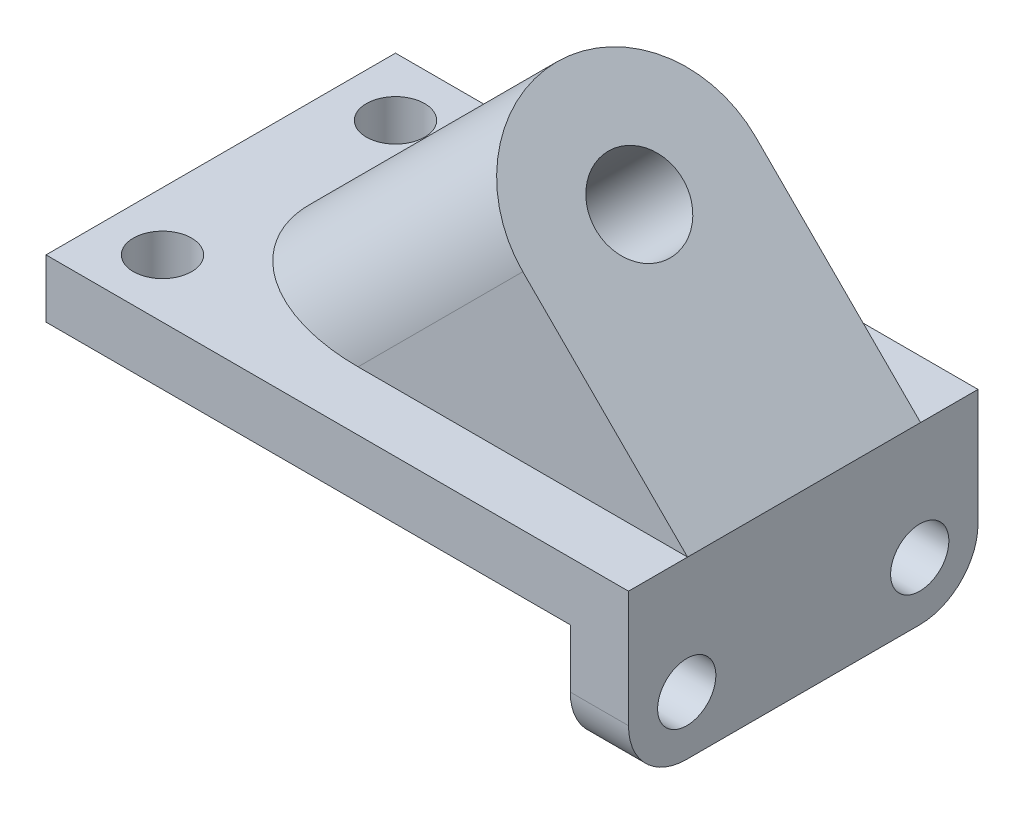
ISO-10303-21;
HEADER;
FILE_DESCRIPTION(('STEP AP214'),'2;1');
FILE_NAME('part.step','',(''),(''),'','','');
FILE_SCHEMA(('AUTOMOTIVE_DESIGN { 1 0 10303 214 1 1 1 1 }'));
ENDSEC;
DATA;
#1=APPLICATION_CONTEXT('core data for automotive mechanical design processes');
#2=APPLICATION_PROTOCOL_DEFINITION('international standard','automotive_design',2000,#1);
#3=PRODUCT_CONTEXT('',#1,'mechanical');
#4=PRODUCT('Part','Part','',(#3));
#5=PRODUCT_RELATED_PRODUCT_CATEGORY('part','',(#4));
#6=PRODUCT_DEFINITION_FORMATION('','',#4);
#7=PRODUCT_DEFINITION_CONTEXT('part definition',#1,'design');
#8=PRODUCT_DEFINITION('design','',#6,#7);
#9=PRODUCT_DEFINITION_SHAPE('','',#8);
#10=(LENGTH_UNIT() NAMED_UNIT(*) SI_UNIT(.MILLI.,.METRE.));
#11=(NAMED_UNIT(*) PLANE_ANGLE_UNIT() SI_UNIT($,.RADIAN.));
#12=(NAMED_UNIT(*) SI_UNIT($,.STERADIAN.) SOLID_ANGLE_UNIT());
#13=UNCERTAINTY_MEASURE_WITH_UNIT(LENGTH_MEASURE(1.E-05),#10,'distance_accuracy_value','');
#14=(GEOMETRIC_REPRESENTATION_CONTEXT(3) GLOBAL_UNCERTAINTY_ASSIGNED_CONTEXT((#13)) GLOBAL_UNIT_ASSIGNED_CONTEXT((#10,
#11,#12)) REPRESENTATION_CONTEXT('',''));
#15=CARTESIAN_POINT('',(0.,0.,0.));
#16=DIRECTION('',(0.,0.,1.));
#17=DIRECTION('',(1.,0.,0.));
#18=AXIS2_PLACEMENT_3D('',#15,#16,#17);
#19=CARTESIAN_POINT('',(0.,12.7,-76.2));
#20=DIRECTION('',(1.,0.,0.));
#21=DIRECTION('',(0.,0.,-1.));
#22=AXIS2_PLACEMENT_3D('',#19,#20,#21);
#23=PLANE('',#22);
#24=DIRECTION('',(0.,0.,1.));
#25=VECTOR('',#24,1.);
#26=CARTESIAN_POINT('',(0.,0.,-76.2));
#27=LINE('',#26,#25);
#28=CARTESIAN_POINT('',(0.,0.,-76.2));
#29=VERTEX_POINT('',#28);
#30=CARTESIAN_POINT('',(0.,0.,0.));
#31=VERTEX_POINT('',#30);
#32=EDGE_CURVE('E180',#29,#31,#27,.T.);
#33=ORIENTED_EDGE('',*,*,#32,.T.);
#34=DIRECTION('',(0.,-1.,0.));
#35=VECTOR('',#34,1.);
#36=CARTESIAN_POINT('',(0.,12.7,0.));
#37=LINE('',#36,#35);
#38=CARTESIAN_POINT('',(0.,12.7,0.));
#39=VERTEX_POINT('',#38);
#40=EDGE_CURVE('E220',#39,#31,#37,.T.);
#41=ORIENTED_EDGE('',*,*,#40,.F.);
#42=DIRECTION('',(0.,0.,1.));
#43=VECTOR('',#42,1.);
#44=CARTESIAN_POINT('',(0.,12.7,-76.2));
#45=LINE('',#44,#43);
#46=CARTESIAN_POINT('',(0.,12.7,-76.2));
#47=VERTEX_POINT('',#46);
#48=EDGE_CURVE('E183',#47,#39,#45,.T.);
#49=ORIENTED_EDGE('',*,*,#48,.F.);
#50=DIRECTION('',(0.,-1.,0.));
#51=VECTOR('',#50,1.);
#52=CARTESIAN_POINT('',(0.,12.7,-76.2));
#53=LINE('',#52,#51);
#54=EDGE_CURVE('E199',#47,#29,#53,.T.);
#55=ORIENTED_EDGE('',*,*,#54,.T.);
#56=EDGE_LOOP('',(#33,#41,#49,#55));
#57=FACE_BOUND('',#56,.T.);
#58=ADVANCED_FACE('F45',(#57),#23,.F.);
#59=CARTESIAN_POINT('',(0.,12.7,0.));
#60=DIRECTION('',(0.,0.,-1.));
#61=DIRECTION('',(-1.,0.,0.));
#62=AXIS2_PLACEMENT_3D('',#59,#60,#61);
#63=PLANE('',#62);
#64=DIRECTION('',(0.,1.,0.));
#65=VECTOR('',#64,1.);
#66=CARTESIAN_POINT('',(114.3,-25.4,0.));
#67=LINE('',#66,#65);
#68=CARTESIAN_POINT('',(114.3,-12.7,0.));
#69=VERTEX_POINT('',#68);
#70=CARTESIAN_POINT('',(114.3,0.,0.));
#71=VERTEX_POINT('',#70);
#72=EDGE_CURVE('E177',#69,#71,#67,.T.);
#73=ORIENTED_EDGE('',*,*,#72,.F.);
#74=DIRECTION('',(1.,0.,0.));
#75=VECTOR('',#74,1.);
#76=CARTESIAN_POINT('',(127.,-12.7,0.));
#77=LINE('',#76,#75);
#78=CARTESIAN_POINT('',(127.,-12.7,0.));
#79=VERTEX_POINT('',#78);
#80=EDGE_CURVE('E228',#69,#79,#77,.T.);
#81=ORIENTED_EDGE('',*,*,#80,.T.);
#82=DIRECTION('',(0.,-1.,0.));
#83=VECTOR('',#82,1.);
#84=CARTESIAN_POINT('',(127.,12.7,0.));
#85=LINE('',#84,#83);
#86=CARTESIAN_POINT('',(127.,12.7,0.));
#87=VERTEX_POINT('',#86);
#88=EDGE_CURVE('E216',#87,#79,#85,.T.);
#89=ORIENTED_EDGE('',*,*,#88,.F.);
#90=DIRECTION('',(1.,0.,0.));
#91=VECTOR('',#90,1.);
#92=CARTESIAN_POINT('',(0.,12.7,0.));
#93=LINE('',#92,#91);
#94=EDGE_CURVE('E187',#39,#87,#93,.T.);
#95=ORIENTED_EDGE('',*,*,#94,.F.);
#96=ORIENTED_EDGE('',*,*,#40,.T.);
#97=DIRECTION('',(1.,0.,0.));
#98=VECTOR('',#97,1.);
#99=CARTESIAN_POINT('',(0.,0.,0.));
#100=LINE('',#99,#98);
#101=EDGE_CURVE('E203',#31,#71,#100,.T.);
#102=ORIENTED_EDGE('',*,*,#101,.T.);
#103=EDGE_LOOP('',(#73,#81,#89,#95,#96,#102));
#104=FACE_BOUND('',#103,.T.);
#105=ADVANCED_FACE('F312',(#104),#63,.F.);
#106=CARTESIAN_POINT('',(127.,12.7,0.));
#107=DIRECTION('',(-1.,0.,0.));
#108=DIRECTION('',(0.,0.,1.));
#109=AXIS2_PLACEMENT_3D('',#106,#107,#108);
#110=PLANE('',#109);
#111=CARTESIAN_POINT('',(127.,-12.7,-12.7));
#112=DIRECTION('',(1.,0.,0.));
#113=DIRECTION('',(0.,0.,-1.));
#114=AXIS2_PLACEMENT_3D('',#111,#112,#113);
#115=CIRCLE('',#114,6.35);
#116=CARTESIAN_POINT('',(127.,-12.7,-19.05));
#117=VERTEX_POINT('',#116);
#118=EDGE_CURVE('E263',#117,#117,#115,.T.);
#119=ORIENTED_EDGE('',*,*,#118,.F.);
#120=EDGE_LOOP('',(#119));
#121=FACE_BOUND('',#120,.T.);
#122=CARTESIAN_POINT('',(127.,-12.7,-63.5));
#123=DIRECTION('',(1.,0.,0.));
#124=DIRECTION('',(0.,0.,-1.));
#125=AXIS2_PLACEMENT_3D('',#122,#123,#124);
#126=CIRCLE('',#125,6.35);
#127=CARTESIAN_POINT('',(127.,-12.7,-69.85));
#128=VERTEX_POINT('',#127);
#129=EDGE_CURVE('E271',#128,#128,#126,.T.);
#130=ORIENTED_EDGE('',*,*,#129,.F.);
#131=EDGE_LOOP('',(#130));
#132=FACE_BOUND('',#131,.T.);
#133=DIRECTION('',(0.,0.,-1.));
#134=VECTOR('',#133,1.);
#135=CARTESIAN_POINT('',(127.,-25.4,-76.2));
#136=LINE('',#135,#134);
#137=CARTESIAN_POINT('',(127.,-25.4,-12.7));
#138=VERTEX_POINT('',#137);
#139=CARTESIAN_POINT('',(127.,-25.4,-63.5));
#140=VERTEX_POINT('',#139);
#141=EDGE_CURVE('E169',#138,#140,#136,.T.);
#142=ORIENTED_EDGE('',*,*,#141,.T.);
#143=CARTESIAN_POINT('',(127.,-12.7,-63.5));
#144=DIRECTION('',(-1.,0.,0.));
#145=DIRECTION('',(0.,0.,1.));
#146=AXIS2_PLACEMENT_3D('',#143,#144,#145);
#147=CIRCLE('',#146,12.7);
#148=CARTESIAN_POINT('',(127.,-12.7,-76.2));
#149=VERTEX_POINT('',#148);
#150=EDGE_CURVE('E55',#140,#149,#147,.F.);
#151=ORIENTED_EDGE('',*,*,#150,.T.);
#152=DIRECTION('',(0.,-1.,0.));
#153=VECTOR('',#152,1.);
#154=CARTESIAN_POINT('',(127.,12.7,-76.2));
#155=LINE('',#154,#153);
#156=CARTESIAN_POINT('',(127.,12.7,-76.2));
#157=VERTEX_POINT('',#156);
#158=EDGE_CURVE('E212',#157,#149,#155,.T.);
#159=ORIENTED_EDGE('',*,*,#158,.F.);
#160=DIRECTION('',(0.,0.,-1.));
#161=VECTOR('',#160,1.);
#162=CARTESIAN_POINT('',(127.,12.7,0.));
#163=LINE('',#162,#161);
#164=CARTESIAN_POINT('',(127.,12.7,-63.678120433143));
#165=VERTEX_POINT('',#164);
#166=EDGE_CURVE('E191',#165,#157,#163,.T.);
#167=ORIENTED_EDGE('',*,*,#166,.F.);
#168=DIRECTION('',(0.,0.,-1.));
#169=VECTOR('',#168,1.);
#170=CARTESIAN_POINT('',(127.,12.7,-63.678120433143));
#171=LINE('',#170,#169);
#172=CARTESIAN_POINT('',(127.,12.7,-12.878120433143));
#173=VERTEX_POINT('',#172);
#174=EDGE_CURVE('E141',#173,#165,#171,.T.);
#175=ORIENTED_EDGE('',*,*,#174,.F.);
#176=EDGE_CURVE('E192',#87,#173,#163,.T.);
#177=ORIENTED_EDGE('',*,*,#176,.F.);
#178=ORIENTED_EDGE('',*,*,#88,.T.);
#179=CARTESIAN_POINT('',(127.,-12.7,-12.7));
#180=DIRECTION('',(-1.,0.,0.));
#181=DIRECTION('',(0.,0.,1.));
#182=AXIS2_PLACEMENT_3D('',#179,#180,#181);
#183=CIRCLE('',#182,12.7);
#184=EDGE_CURVE('E232',#79,#138,#183,.F.);
#185=ORIENTED_EDGE('',*,*,#184,.T.);
#186=EDGE_LOOP('',(#142,#151,#159,#167,#175,#177,#178,#185));
#187=FACE_BOUND('',#186,.T.);
#188=ADVANCED_FACE('F296',(#121,#132,#187),#110,.F.);
#189=CARTESIAN_POINT('',(127.,12.7,-76.2));
#190=DIRECTION('',(0.,0.,1.));
#191=DIRECTION('',(1.,0.,0.));
#192=AXIS2_PLACEMENT_3D('',#189,#190,#191);
#193=PLANE('',#192);
#194=ORIENTED_EDGE('',*,*,#158,.T.);
#195=DIRECTION('',(-1.,0.,0.));
#196=VECTOR('',#195,1.);
#197=CARTESIAN_POINT('',(114.3,-12.7,-76.2));
#198=LINE('',#197,#196);
#199=CARTESIAN_POINT('',(114.3,-12.7,-76.2));
#200=VERTEX_POINT('',#199);
#201=EDGE_CURVE('E242',#149,#200,#198,.T.);
#202=ORIENTED_EDGE('',*,*,#201,.T.);
#203=DIRECTION('',(0.,1.,0.));
#204=VECTOR('',#203,1.);
#205=CARTESIAN_POINT('',(114.3,-25.4,-76.2));
#206=LINE('',#205,#204);
#207=CARTESIAN_POINT('',(114.3,0.,-76.2));
#208=VERTEX_POINT('',#207);
#209=EDGE_CURVE('E176',#200,#208,#206,.T.);
#210=ORIENTED_EDGE('',*,*,#209,.T.);
#211=DIRECTION('',(-1.,0.,0.));
#212=VECTOR('',#211,1.);
#213=CARTESIAN_POINT('',(127.,0.,-76.2));
#214=LINE('',#213,#212);
#215=EDGE_CURVE('E188',#208,#29,#214,.T.);
#216=ORIENTED_EDGE('',*,*,#215,.T.);
#217=ORIENTED_EDGE('',*,*,#54,.F.);
#218=DIRECTION('',(-1.,0.,0.));
#219=VECTOR('',#218,1.);
#220=CARTESIAN_POINT('',(127.,12.7,-76.2));
#221=LINE('',#220,#219);
#222=EDGE_CURVE('E196',#157,#47,#221,.T.);
#223=ORIENTED_EDGE('',*,*,#222,.F.);
#224=EDGE_LOOP('',(#194,#202,#210,#216,#217,#223));
#225=FACE_BOUND('',#224,.T.);
#226=ADVANCED_FACE('F304',(#225),#193,.F.);
#227=CARTESIAN_POINT('',(0.,12.7,0.));
#228=DIRECTION('',(0.,1.,0.));
#229=DIRECTION('',(0.,0.,1.));
#230=AXIS2_PLACEMENT_3D('',#227,#228,#229);
#231=PLANE('',#230);
#232=CARTESIAN_POINT('',(12.7,12.7,-63.5));
#233=DIRECTION('',(0.,1.,0.));
#234=DIRECTION('',(0.,0.,1.));
#235=AXIS2_PLACEMENT_3D('',#232,#233,#234);
#236=CIRCLE('',#235,6.35);
#237=CARTESIAN_POINT('',(12.7,12.7,-57.15));
#238=VERTEX_POINT('',#237);
#239=EDGE_CURVE('E257',#238,#238,#236,.T.);
#240=ORIENTED_EDGE('',*,*,#239,.F.);
#241=EDGE_LOOP('',(#240));
#242=FACE_BOUND('',#241,.T.);
#243=CARTESIAN_POINT('',(12.7,12.7,-12.7));
#244=DIRECTION('',(0.,1.,0.));
#245=DIRECTION('',(0.,0.,1.));
#246=AXIS2_PLACEMENT_3D('',#243,#244,#245);
#247=CIRCLE('',#246,6.35);
#248=CARTESIAN_POINT('',(12.7,12.7,-6.35));
#249=VERTEX_POINT('',#248);
#250=EDGE_CURVE('E269',#249,#249,#247,.T.);
#251=ORIENTED_EDGE('',*,*,#250,.F.);
#252=EDGE_LOOP('',(#251));
#253=FACE_BOUND('',#252,.T.);
#254=CARTESIAN_POINT('',(55.1579510314467,12.7,-38.278120433143));
#255=DIRECTION('',(0.,1.,0.));
#256=DIRECTION('',(1.,0.,0.));
#257=AXIS2_PLACEMENT_3D('',#254,#255,#256);
#258=ELLIPSE('',#257,35.9210244842767,25.4);
#259=CARTESIAN_POINT('',(55.1579510314467,12.7,-12.878120433143));
#260=VERTEX_POINT('',#259);
#261=CARTESIAN_POINT('',(55.1579510314467,12.7,-63.678120433143));
#262=VERTEX_POINT('',#261);
#263=EDGE_CURVE('E288',#260,#262,#258,.F.);
#264=ORIENTED_EDGE('',*,*,#263,.T.);
#265=DIRECTION('',(1.,0.,0.));
#266=VECTOR('',#265,1.);
#267=CARTESIAN_POINT('',(21.8899565270854,12.7,-63.678120433143));
#268=LINE('',#267,#266);
#269=EDGE_CURVE('E63',#262,#165,#268,.T.);
#270=ORIENTED_EDGE('',*,*,#269,.T.);
#271=ORIENTED_EDGE('',*,*,#166,.T.);
#272=ORIENTED_EDGE('',*,*,#222,.T.);
#273=ORIENTED_EDGE('',*,*,#48,.T.);
#274=ORIENTED_EDGE('',*,*,#94,.T.);
#275=ORIENTED_EDGE('',*,*,#176,.T.);
#276=DIRECTION('',(-1.,0.,0.));
#277=VECTOR('',#276,1.);
#278=CARTESIAN_POINT('',(21.8899565270854,12.7,-12.878120433143));
#279=LINE('',#278,#277);
#280=EDGE_CURVE('E173',#173,#260,#279,.T.);
#281=ORIENTED_EDGE('',*,*,#280,.T.);
#282=EDGE_LOOP('',(#264,#270,#271,#272,#273,#274,#275,#281));
#283=FACE_BOUND('',#282,.T.);
#284=ADVANCED_FACE('F293',(#242,#253,#283),#231,.T.);
#285=CARTESIAN_POINT('',(0.,0.,0.));
#286=DIRECTION('',(0.,1.,0.));
#287=DIRECTION('',(0.,0.,1.));
#288=AXIS2_PLACEMENT_3D('',#285,#286,#287);
#289=PLANE('',#288);
#290=CARTESIAN_POINT('',(12.7,0.,-63.5));
#291=DIRECTION('',(0.,1.,0.));
#292=DIRECTION('',(0.,0.,1.));
#293=AXIS2_PLACEMENT_3D('',#290,#291,#292);
#294=CIRCLE('',#293,6.35);
#295=CARTESIAN_POINT('',(12.7,0.,-57.15));
#296=VERTEX_POINT('',#295);
#297=EDGE_CURVE('E159',#296,#296,#294,.T.);
#298=ORIENTED_EDGE('',*,*,#297,.T.);
#299=EDGE_LOOP('',(#298));
#300=FACE_BOUND('',#299,.T.);
#301=CARTESIAN_POINT('',(12.7,0.,-12.7));
#302=DIRECTION('',(0.,1.,0.));
#303=DIRECTION('',(0.,0.,1.));
#304=AXIS2_PLACEMENT_3D('',#301,#302,#303);
#305=CIRCLE('',#304,6.35);
#306=CARTESIAN_POINT('',(12.7,0.,-6.35));
#307=VERTEX_POINT('',#306);
#308=EDGE_CURVE('E253',#307,#307,#305,.T.);
#309=ORIENTED_EDGE('',*,*,#308,.T.);
#310=EDGE_LOOP('',(#309));
#311=FACE_BOUND('',#310,.T.);
#312=ORIENTED_EDGE('',*,*,#215,.F.);
#313=DIRECTION('',(0.,0.,1.));
#314=VECTOR('',#313,1.);
#315=CARTESIAN_POINT('',(114.3,0.,0.));
#316=LINE('',#315,#314);
#317=EDGE_CURVE('E224',#208,#71,#316,.T.);
#318=ORIENTED_EDGE('',*,*,#317,.T.);
#319=ORIENTED_EDGE('',*,*,#101,.F.);
#320=ORIENTED_EDGE('',*,*,#32,.F.);
#321=EDGE_LOOP('',(#312,#318,#319,#320));
#322=FACE_BOUND('',#321,.T.);
#323=ADVANCED_FACE('F353',(#300,#311,#322),#289,.F.);
#324=CARTESIAN_POINT('',(114.3,-25.4,-76.2));
#325=DIRECTION('',(-1.,0.,0.));
#326=DIRECTION('',(0.,0.,1.));
#327=AXIS2_PLACEMENT_3D('',#324,#325,#326);
#328=PLANE('',#327);
#329=CARTESIAN_POINT('',(114.3,-12.7,-12.7));
#330=DIRECTION('',(-1.,0.,0.));
#331=DIRECTION('',(0.,0.,1.));
#332=AXIS2_PLACEMENT_3D('',#329,#330,#331);
#333=CIRCLE('',#332,6.35);
#334=CARTESIAN_POINT('',(114.3,-12.7,-19.05));
#335=VERTEX_POINT('',#334);
#336=EDGE_CURVE('E49',#335,#335,#333,.T.);
#337=ORIENTED_EDGE('',*,*,#336,.F.);
#338=EDGE_LOOP('',(#337));
#339=FACE_BOUND('',#338,.T.);
#340=CARTESIAN_POINT('',(114.3,-12.7,-63.5));
#341=DIRECTION('',(-1.,0.,0.));
#342=DIRECTION('',(0.,0.,1.));
#343=AXIS2_PLACEMENT_3D('',#340,#341,#342);
#344=CIRCLE('',#343,6.35);
#345=CARTESIAN_POINT('',(114.3,-12.7,-69.85));
#346=VERTEX_POINT('',#345);
#347=EDGE_CURVE('E260',#346,#346,#344,.T.);
#348=ORIENTED_EDGE('',*,*,#347,.F.);
#349=EDGE_LOOP('',(#348));
#350=FACE_BOUND('',#349,.T.);
#351=ORIENTED_EDGE('',*,*,#209,.F.);
#352=CARTESIAN_POINT('',(114.3,-12.7,-63.5));
#353=DIRECTION('',(-1.,0.,0.));
#354=DIRECTION('',(0.,0.,1.));
#355=AXIS2_PLACEMENT_3D('',#352,#353,#354);
#356=CIRCLE('',#355,12.7);
#357=CARTESIAN_POINT('',(114.3,-25.4,-63.5));
#358=VERTEX_POINT('',#357);
#359=EDGE_CURVE('E246',#200,#358,#356,.T.);
#360=ORIENTED_EDGE('',*,*,#359,.T.);
#361=DIRECTION('',(0.,0.,1.));
#362=VECTOR('',#361,1.);
#363=CARTESIAN_POINT('',(114.3,-25.4,-76.2));
#364=LINE('',#363,#362);
#365=CARTESIAN_POINT('',(114.3,-25.4,-12.7));
#366=VERTEX_POINT('',#365);
#367=EDGE_CURVE('E172',#358,#366,#364,.T.);
#368=ORIENTED_EDGE('',*,*,#367,.T.);
#369=CARTESIAN_POINT('',(114.3,-12.7,-12.7));
#370=DIRECTION('',(-1.,0.,0.));
#371=DIRECTION('',(0.,0.,1.));
#372=AXIS2_PLACEMENT_3D('',#369,#370,#371);
#373=CIRCLE('',#372,12.7);
#374=EDGE_CURVE('E239',#366,#69,#373,.T.);
#375=ORIENTED_EDGE('',*,*,#374,.T.);
#376=ORIENTED_EDGE('',*,*,#72,.T.);
#377=ORIENTED_EDGE('',*,*,#317,.F.);
#378=EDGE_LOOP('',(#351,#360,#368,#375,#376,#377));
#379=FACE_BOUND('',#378,.T.);
#380=ADVANCED_FACE('F344',(#339,#350,#379),#328,.T.);
#381=CARTESIAN_POINT('',(0.,-25.4,0.));
#382=DIRECTION('',(0.,-1.,0.));
#383=DIRECTION('',(0.,0.,-1.));
#384=AXIS2_PLACEMENT_3D('',#381,#382,#383);
#385=PLANE('',#384);
#386=ORIENTED_EDGE('',*,*,#367,.F.);
#387=DIRECTION('',(-1.,0.,0.));
#388=VECTOR('',#387,1.);
#389=CARTESIAN_POINT('',(127.,-25.4,-63.5));
#390=LINE('',#389,#388);
#391=EDGE_CURVE('E71',#358,#140,#390,.F.);
#392=ORIENTED_EDGE('',*,*,#391,.T.);
#393=ORIENTED_EDGE('',*,*,#141,.F.);
#394=DIRECTION('',(1.,0.,0.));
#395=VECTOR('',#394,1.);
#396=CARTESIAN_POINT('',(114.3,-25.4,-12.7));
#397=LINE('',#396,#395);
#398=EDGE_CURVE('E235',#138,#366,#397,.F.);
#399=ORIENTED_EDGE('',*,*,#398,.T.);
#400=EDGE_LOOP('',(#386,#392,#393,#399));
#401=FACE_BOUND('',#400,.T.);
#402=ADVANCED_FACE('F335',(#401),#385,.T.);
#403=CARTESIAN_POINT('',(0.,-12.7,-12.7));
#404=DIRECTION('',(-1.,0.,0.));
#405=DIRECTION('',(0.,0.,1.));
#406=AXIS2_PLACEMENT_3D('',#403,#404,#405);
#407=CYLINDRICAL_SURFACE('',#406,12.7);
#408=ORIENTED_EDGE('',*,*,#374,.F.);
#409=ORIENTED_EDGE('',*,*,#398,.F.);
#410=ORIENTED_EDGE('',*,*,#184,.F.);
#411=ORIENTED_EDGE('',*,*,#80,.F.);
#412=EDGE_LOOP('',(#408,#409,#410,#411));
#413=FACE_BOUND('',#412,.T.);
#414=ADVANCED_FACE('F333',(#413),#407,.T.);
#415=CARTESIAN_POINT('',(127.,-12.7,-63.5));
#416=DIRECTION('',(1.,0.,0.));
#417=DIRECTION('',(0.,0.,-1.));
#418=AXIS2_PLACEMENT_3D('',#415,#416,#417);
#419=CYLINDRICAL_SURFACE('',#418,12.7);
#420=ORIENTED_EDGE('',*,*,#150,.F.);
#421=ORIENTED_EDGE('',*,*,#391,.F.);
#422=ORIENTED_EDGE('',*,*,#359,.F.);
#423=ORIENTED_EDGE('',*,*,#201,.F.);
#424=EDGE_LOOP('',(#420,#421,#422,#423));
#425=FACE_BOUND('',#424,.T.);
#426=ADVANCED_FACE('F47',(#425),#419,.T.);
#427=CARTESIAN_POINT('',(-14.0310679571912,-56.4890189886376,-38.278120433143));
#428=DIRECTION('',(0.707106781186549,0.707106781186546,0.));
#429=DIRECTION('',(-0.707106781186546,0.707106781186549,0.));
#430=AXIS2_PLACEMENT_3D('',#427,#428,#429);
#431=CYLINDRICAL_SURFACE('',#430,9.525);
#432=CARTESIAN_POINT('',(55.1579510314467,12.7,-38.278120433143));
#433=DIRECTION('',(0.,1.,0.));
#434=DIRECTION('',(1.,0.,0.));
#435=AXIS2_PLACEMENT_3D('',#432,#433,#434);
#436=ELLIPSE('',#435,13.4703841816038,9.525);
#437=CARTESIAN_POINT('',(68.6283352130504,12.7,-38.278120433143));
#438=VERTEX_POINT('',#437);
#439=EDGE_CURVE('E11',#438,#438,#436,.F.);
#440=ORIENTED_EDGE('',*,*,#439,.T.);
#441=EDGE_LOOP('',(#440));
#442=FACE_BOUND('',#441,.T.);
#443=CARTESIAN_POINT('',(91.0789755157235,48.6210244842767,-38.278120433143));
#444=DIRECTION('',(0.707106781186549,0.707106781186546,0.));
#445=DIRECTION('',(-0.707106781186546,0.707106781186549,0.));
#446=AXIS2_PLACEMENT_3D('',#443,#444,#445);
#447=CIRCLE('',#446,9.525);
#448=CARTESIAN_POINT('',(84.3437834249216,55.3562165750786,-38.278120433143));
#449=VERTEX_POINT('',#448);
#450=EDGE_CURVE('E155',#449,#449,#447,.T.);
#451=ORIENTED_EDGE('',*,*,#450,.T.);
#452=EDGE_LOOP('',(#451));
#453=FACE_BOUND('',#452,.T.);
#454=ADVANCED_FACE('F341',(#442,#453),#431,.F.);
#455=CARTESIAN_POINT('',(91.0789755157235,48.6210244842767,-38.278120433143));
#456=DIRECTION('',(-0.707106781186549,-0.707106781186546,0.));
#457=DIRECTION('',(0.707106781186546,-0.707106781186549,0.));
#458=AXIS2_PLACEMENT_3D('',#455,#456,#457);
#459=PLANE('',#458);
#460=ORIENTED_EDGE('',*,*,#450,.F.);
#461=EDGE_LOOP('',(#460));
#462=FACE_BOUND('',#461,.T.);
#463=DIRECTION('',(-0.707106781186546,0.707106781186549,0.));
#464=VECTOR('',#463,1.);
#465=CARTESIAN_POINT('',(127.,12.7,-63.678120433143));
#466=LINE('',#465,#464);
#467=CARTESIAN_POINT('',(91.0789755157235,48.6210244842767,-63.678120433143));
#468=VERTEX_POINT('',#467);
#469=EDGE_CURVE('E134',#165,#468,#466,.T.);
#470=ORIENTED_EDGE('',*,*,#469,.T.);
#471=CARTESIAN_POINT('',(91.0789755157235,48.6210244842767,-38.278120433143));
#472=DIRECTION('',(0.707106781186549,0.707106781186546,0.));
#473=DIRECTION('',(0.707106781186546,-0.707106781186549,0.));
#474=AXIS2_PLACEMENT_3D('',#471,#472,#473);
#475=CIRCLE('',#474,25.4);
#476=CARTESIAN_POINT('',(91.0789755157235,48.6210244842767,-12.878120433143));
#477=VERTEX_POINT('',#476);
#478=EDGE_CURVE('E144',#468,#477,#475,.T.);
#479=ORIENTED_EDGE('',*,*,#478,.T.);
#480=DIRECTION('',(0.707106781186546,-0.707106781186549,0.));
#481=VECTOR('',#480,1.);
#482=CARTESIAN_POINT('',(127.,12.7,-12.878120433143));
#483=LINE('',#482,#481);
#484=EDGE_CURVE('E150',#477,#173,#483,.T.);
#485=ORIENTED_EDGE('',*,*,#484,.T.);
#486=ORIENTED_EDGE('',*,*,#174,.T.);
#487=EDGE_LOOP('',(#470,#479,#485,#486));
#488=FACE_BOUND('',#487,.T.);
#489=ADVANCED_FACE('F152',(#462,#488),#459,.F.);
#490=CARTESIAN_POINT('',(-14.0310679571912,-56.4890189886376,-38.278120433143));
#491=DIRECTION('',(0.707106781186549,0.707106781186546,0.));
#492=DIRECTION('',(-0.707106781186546,0.707106781186549,0.));
#493=AXIS2_PLACEMENT_3D('',#490,#491,#492);
#494=CYLINDRICAL_SURFACE('',#493,25.4);
#495=ORIENTED_EDGE('',*,*,#263,.F.);
#496=DIRECTION('',(0.707106781186549,0.707106781186546,0.));
#497=VECTOR('',#496,1.);
#498=CARTESIAN_POINT('',(-14.0310679571912,-56.4890189886376,-12.878120433143));
#499=LINE('',#498,#497);
#500=EDGE_CURVE('E140',#260,#477,#499,.T.);
#501=ORIENTED_EDGE('',*,*,#500,.T.);
#502=ORIENTED_EDGE('',*,*,#478,.F.);
#503=DIRECTION('',(0.707106781186549,0.707106781186546,0.));
#504=VECTOR('',#503,1.);
#505=CARTESIAN_POINT('',(-14.0310679571912,-56.4890189886376,-63.678120433143));
#506=LINE('',#505,#504);
#507=EDGE_CURVE('E130',#262,#468,#506,.T.);
#508=ORIENTED_EDGE('',*,*,#507,.F.);
#509=EDGE_LOOP('',(#495,#501,#502,#508));
#510=FACE_BOUND('',#509,.T.);
#511=ADVANCED_FACE('F145',(#510),#494,.T.);
#512=CARTESIAN_POINT('',(21.8899565270854,-92.4100434729143,-12.878120433143));
#513=DIRECTION('',(0.,0.,1.));
#514=DIRECTION('',(1.,0.,0.));
#515=AXIS2_PLACEMENT_3D('',#512,#513,#514);
#516=PLANE('',#515);
#517=ORIENTED_EDGE('',*,*,#280,.F.);
#518=ORIENTED_EDGE('',*,*,#484,.F.);
#519=ORIENTED_EDGE('',*,*,#500,.F.);
#520=EDGE_LOOP('',(#517,#518,#519));
#521=FACE_BOUND('',#520,.T.);
#522=ADVANCED_FACE('F315',(#521),#516,.T.);
#523=CARTESIAN_POINT('',(21.8899565270854,-92.4100434729143,-63.678120433143));
#524=DIRECTION('',(0.,0.,-1.));
#525=DIRECTION('',(-1.,0.,0.));
#526=AXIS2_PLACEMENT_3D('',#523,#524,#525);
#527=PLANE('',#526);
#528=ORIENTED_EDGE('',*,*,#269,.F.);
#529=ORIENTED_EDGE('',*,*,#507,.T.);
#530=ORIENTED_EDGE('',*,*,#469,.F.);
#531=EDGE_LOOP('',(#528,#529,#530));
#532=FACE_BOUND('',#531,.T.);
#533=ADVANCED_FACE('F132',(#532),#527,.T.);
#534=ORIENTED_EDGE('',*,*,#439,.F.);
#535=EDGE_LOOP('',(#534));
#536=FACE_BOUND('',#535,.T.);
#537=ADVANCED_FACE('F322',(#536),#231,.T.);
#538=CARTESIAN_POINT('',(12.7,-25.4,-12.7));
#539=DIRECTION('',(0.,1.,0.));
#540=DIRECTION('',(0.,0.,1.));
#541=AXIS2_PLACEMENT_3D('',#538,#539,#540);
#542=CYLINDRICAL_SURFACE('',#541,6.35);
#543=CARTESIAN_POINT('',(12.7,12.7,-6.35));
#544=CARTESIAN_POINT('',(12.7,12.5677083333333,-6.35));
#545=CARTESIAN_POINT('',(12.7,12.4354166666667,-6.35));
#546=CARTESIAN_POINT('',(12.7,12.1708333333333,-6.35));
#547=CARTESIAN_POINT('',(12.7,12.0385416666667,-6.35));
#548=CARTESIAN_POINT('',(12.7,11.7739583333333,-6.35));
#549=CARTESIAN_POINT('',(12.7,11.6416666666667,-6.35));
#550=CARTESIAN_POINT('',(12.7,11.3770833333333,-6.35));
#551=CARTESIAN_POINT('',(12.7,11.2447916666667,-6.35));
#552=CARTESIAN_POINT('',(12.7,10.9802083333333,-6.35));
#553=CARTESIAN_POINT('',(12.7,10.8479166666667,-6.35));
#554=CARTESIAN_POINT('',(12.7,10.5833333333333,-6.35));
#555=CARTESIAN_POINT('',(12.7,10.4510416666667,-6.35));
#556=CARTESIAN_POINT('',(12.7,10.1864583333333,-6.35));
#557=CARTESIAN_POINT('',(12.7,10.0541666666667,-6.35));
#558=CARTESIAN_POINT('',(12.7,9.78958333333333,-6.35));
#559=CARTESIAN_POINT('',(12.7,9.65729166666667,-6.35));
#560=CARTESIAN_POINT('',(12.7,9.39270833333333,-6.35));
#561=CARTESIAN_POINT('',(12.7,9.26041666666666,-6.35));
#562=CARTESIAN_POINT('',(12.7,8.99583333333333,-6.35));
#563=CARTESIAN_POINT('',(12.7,8.86354166666666,-6.35));
#564=CARTESIAN_POINT('',(12.7,8.59895833333333,-6.35));
#565=CARTESIAN_POINT('',(12.7,8.46666666666667,-6.35));
#566=CARTESIAN_POINT('',(12.7,8.20208333333333,-6.35));
#567=CARTESIAN_POINT('',(12.7,8.06979166666666,-6.35));
#568=CARTESIAN_POINT('',(12.7,7.80520833333333,-6.35));
#569=CARTESIAN_POINT('',(12.7,7.67291666666666,-6.35));
#570=CARTESIAN_POINT('',(12.7,7.40833333333333,-6.35));
#571=CARTESIAN_POINT('',(12.7,7.27604166666667,-6.35));
#572=CARTESIAN_POINT('',(12.7,7.01145833333333,-6.35));
#573=CARTESIAN_POINT('',(12.7,6.87916666666666,-6.35));
#574=CARTESIAN_POINT('',(12.7,6.61458333333333,-6.35));
#575=CARTESIAN_POINT('',(12.7,6.48229166666666,-6.35));
#576=CARTESIAN_POINT('',(12.7,6.21770833333333,-6.35));
#577=CARTESIAN_POINT('',(12.7,6.08541666666667,-6.35));
#578=CARTESIAN_POINT('',(12.7,5.82083333333333,-6.35));
#579=CARTESIAN_POINT('',(12.7,5.68854166666667,-6.35));
#580=CARTESIAN_POINT('',(12.7,5.42395833333333,-6.35));
#581=CARTESIAN_POINT('',(12.7,5.29166666666667,-6.35));
#582=CARTESIAN_POINT('',(12.7,5.02708333333333,-6.35));
#583=CARTESIAN_POINT('',(12.7,4.89479166666667,-6.35));
#584=CARTESIAN_POINT('',(12.7,4.63020833333334,-6.35));
#585=CARTESIAN_POINT('',(12.7,4.49791666666667,-6.35));
#586=CARTESIAN_POINT('',(12.7,4.23333333333333,-6.35));
#587=CARTESIAN_POINT('',(12.7,4.10104166666667,-6.35));
#588=CARTESIAN_POINT('',(12.7,3.83645833333333,-6.35));
#589=CARTESIAN_POINT('',(12.7,3.70416666666667,-6.35));
#590=CARTESIAN_POINT('',(12.7,3.43958333333333,-6.35));
#591=CARTESIAN_POINT('',(12.7,3.30729166666667,-6.35));
#592=CARTESIAN_POINT('',(12.7,3.04270833333333,-6.35));
#593=CARTESIAN_POINT('',(12.7,2.91041666666667,-6.35));
#594=CARTESIAN_POINT('',(12.7,2.64583333333333,-6.35));
#595=CARTESIAN_POINT('',(12.7,2.51354166666667,-6.35));
#596=CARTESIAN_POINT('',(12.7,2.24895833333333,-6.35));
#597=CARTESIAN_POINT('',(12.7,2.11666666666667,-6.35));
#598=CARTESIAN_POINT('',(12.7,1.85208333333333,-6.35));
#599=CARTESIAN_POINT('',(12.7,1.71979166666667,-6.35));
#600=CARTESIAN_POINT('',(12.7,1.45520833333333,-6.35));
#601=CARTESIAN_POINT('',(12.7,1.32291666666667,-6.35));
#602=CARTESIAN_POINT('',(12.7,1.05833333333333,-6.35));
#603=CARTESIAN_POINT('',(12.7,0.926041666666666,-6.35));
#604=CARTESIAN_POINT('',(12.7,0.661458333333332,-6.35));
#605=CARTESIAN_POINT('',(12.7,0.529166666666665,-6.35));
#606=CARTESIAN_POINT('',(12.7,0.264583333333332,-6.35));
#607=CARTESIAN_POINT('',(12.7,0.132291666666666,-6.35));
#608=CARTESIAN_POINT('',(12.7,0.,-6.35));
#609=B_SPLINE_CURVE_WITH_KNOTS('',3,(#543,#544,#545,#546,#547,#548,#549,#550,#551,#552,#553,
#554,#555,#556,#557,#558,#559,#560,#561,#562,#563,#564,#565,#566,#567,#568,#569,#570,#571,#572,
#573,#574,#575,#576,#577,#578,#579,#580,#581,#582,#583,#584,#585,#586,#587,#588,#589,#590,#591,
#592,#593,#594,#595,#596,#597,#598,#599,#600,#601,#602,#603,#604,#605,#606,#607,#608),
.UNSPECIFIED.,.F.,.F.,(4,2,2,2,2,2,2,2,2,2,2,2,2,2,2,2,2,2,2,2,2,2,2,2,2,2,2,2,2,2,2,2,4),(0.,
0.396874999999998,0.793750000000003,1.190625,1.5875,1.984375,2.38125,2.778125,3.175,3.571875,
3.96875,4.365625,4.7625,5.159375,5.55625,5.953125,6.35,6.746875,7.14375,7.540625,7.9375,
8.334375,8.73125,9.128125,9.525,9.921875,10.31875,10.715625,11.1125,11.509375,11.90625,
12.303125,12.7),.UNSPECIFIED.);
#610=EDGE_CURVE('BSEAM386',#249,#307,#609,.T.);
#611=ORIENTED_EDGE('',*,*,#250,.T.);
#612=ORIENTED_EDGE('',*,*,#308,.F.);
#613=ORIENTED_EDGE('',*,*,#610,.T.);
#614=ORIENTED_EDGE('',*,*,#610,.F.);
#615=EDGE_LOOP('',(#611,#613,#612,#614));
#616=FACE_BOUND('',#615,.T.);
#617=ADVANCED_FACE('F386',(#616),#542,.F.);
#618=CARTESIAN_POINT('',(12.7,-25.4,-63.5));
#619=DIRECTION('',(0.,1.,0.));
#620=DIRECTION('',(0.,0.,1.));
#621=AXIS2_PLACEMENT_3D('',#618,#619,#620);
#622=CYLINDRICAL_SURFACE('',#621,6.35);
#623=CARTESIAN_POINT('',(12.7,12.7,-57.15));
#624=CARTESIAN_POINT('',(12.7,12.5677083333333,-57.15));
#625=CARTESIAN_POINT('',(12.7,12.4354166666667,-57.15));
#626=CARTESIAN_POINT('',(12.7,12.1708333333333,-57.15));
#627=CARTESIAN_POINT('',(12.7,12.0385416666667,-57.15));
#628=CARTESIAN_POINT('',(12.7,11.7739583333333,-57.15));
#629=CARTESIAN_POINT('',(12.7,11.6416666666667,-57.15));
#630=CARTESIAN_POINT('',(12.7,11.3770833333333,-57.15));
#631=CARTESIAN_POINT('',(12.7,11.2447916666667,-57.15));
#632=CARTESIAN_POINT('',(12.7,10.9802083333333,-57.15));
#633=CARTESIAN_POINT('',(12.7,10.8479166666667,-57.15));
#634=CARTESIAN_POINT('',(12.7,10.5833333333333,-57.15));
#635=CARTESIAN_POINT('',(12.7,10.4510416666667,-57.15));
#636=CARTESIAN_POINT('',(12.7,10.1864583333333,-57.15));
#637=CARTESIAN_POINT('',(12.7,10.0541666666667,-57.15));
#638=CARTESIAN_POINT('',(12.7,9.78958333333333,-57.15));
#639=CARTESIAN_POINT('',(12.7,9.65729166666667,-57.15));
#640=CARTESIAN_POINT('',(12.7,9.39270833333333,-57.15));
#641=CARTESIAN_POINT('',(12.7,9.26041666666666,-57.15));
#642=CARTESIAN_POINT('',(12.7,8.99583333333333,-57.15));
#643=CARTESIAN_POINT('',(12.7,8.86354166666666,-57.15));
#644=CARTESIAN_POINT('',(12.7,8.59895833333333,-57.15));
#645=CARTESIAN_POINT('',(12.7,8.46666666666667,-57.15));
#646=CARTESIAN_POINT('',(12.7,8.20208333333333,-57.15));
#647=CARTESIAN_POINT('',(12.7,8.06979166666666,-57.15));
#648=CARTESIAN_POINT('',(12.7,7.80520833333333,-57.15));
#649=CARTESIAN_POINT('',(12.7,7.67291666666666,-57.15));
#650=CARTESIAN_POINT('',(12.7,7.40833333333333,-57.15));
#651=CARTESIAN_POINT('',(12.7,7.27604166666667,-57.15));
#652=CARTESIAN_POINT('',(12.7,7.01145833333333,-57.15));
#653=CARTESIAN_POINT('',(12.7,6.87916666666666,-57.15));
#654=CARTESIAN_POINT('',(12.7,6.61458333333333,-57.15));
#655=CARTESIAN_POINT('',(12.7,6.48229166666666,-57.15));
#656=CARTESIAN_POINT('',(12.7,6.21770833333333,-57.15));
#657=CARTESIAN_POINT('',(12.7,6.08541666666667,-57.15));
#658=CARTESIAN_POINT('',(12.7,5.82083333333333,-57.15));
#659=CARTESIAN_POINT('',(12.7,5.68854166666667,-57.15));
#660=CARTESIAN_POINT('',(12.7,5.42395833333333,-57.15));
#661=CARTESIAN_POINT('',(12.7,5.29166666666667,-57.15));
#662=CARTESIAN_POINT('',(12.7,5.02708333333333,-57.15));
#663=CARTESIAN_POINT('',(12.7,4.89479166666667,-57.15));
#664=CARTESIAN_POINT('',(12.7,4.63020833333334,-57.15));
#665=CARTESIAN_POINT('',(12.7,4.49791666666667,-57.15));
#666=CARTESIAN_POINT('',(12.7,4.23333333333333,-57.15));
#667=CARTESIAN_POINT('',(12.7,4.10104166666667,-57.15));
#668=CARTESIAN_POINT('',(12.7,3.83645833333333,-57.15));
#669=CARTESIAN_POINT('',(12.7,3.70416666666667,-57.15));
#670=CARTESIAN_POINT('',(12.7,3.43958333333333,-57.15));
#671=CARTESIAN_POINT('',(12.7,3.30729166666667,-57.15));
#672=CARTESIAN_POINT('',(12.7,3.04270833333333,-57.15));
#673=CARTESIAN_POINT('',(12.7,2.91041666666667,-57.15));
#674=CARTESIAN_POINT('',(12.7,2.64583333333333,-57.15));
#675=CARTESIAN_POINT('',(12.7,2.51354166666667,-57.15));
#676=CARTESIAN_POINT('',(12.7,2.24895833333333,-57.15));
#677=CARTESIAN_POINT('',(12.7,2.11666666666667,-57.15));
#678=CARTESIAN_POINT('',(12.7,1.85208333333333,-57.15));
#679=CARTESIAN_POINT('',(12.7,1.71979166666667,-57.15));
#680=CARTESIAN_POINT('',(12.7,1.45520833333333,-57.15));
#681=CARTESIAN_POINT('',(12.7,1.32291666666667,-57.15));
#682=CARTESIAN_POINT('',(12.7,1.05833333333333,-57.15));
#683=CARTESIAN_POINT('',(12.7,0.926041666666666,-57.15));
#684=CARTESIAN_POINT('',(12.7,0.661458333333332,-57.15));
#685=CARTESIAN_POINT('',(12.7,0.529166666666665,-57.15));
#686=CARTESIAN_POINT('',(12.7,0.264583333333332,-57.15));
#687=CARTESIAN_POINT('',(12.7,0.132291666666666,-57.15));
#688=CARTESIAN_POINT('',(12.7,0.,-57.15));
#689=B_SPLINE_CURVE_WITH_KNOTS('',3,(#623,#624,#625,#626,#627,#628,#629,#630,#631,#632,#633,
#634,#635,#636,#637,#638,#639,#640,#641,#642,#643,#644,#645,#646,#647,#648,#649,#650,#651,#652,
#653,#654,#655,#656,#657,#658,#659,#660,#661,#662,#663,#664,#665,#666,#667,#668,#669,#670,#671,
#672,#673,#674,#675,#676,#677,#678,#679,#680,#681,#682,#683,#684,#685,#686,#687,#688),
.UNSPECIFIED.,.F.,.F.,(4,2,2,2,2,2,2,2,2,2,2,2,2,2,2,2,2,2,2,2,2,2,2,2,2,2,2,2,2,2,2,2,4),(0.,
0.396874999999998,0.793750000000003,1.190625,1.5875,1.984375,2.38125,2.778125,3.175,3.571875,
3.96875,4.365625,4.7625,5.159375,5.55625,5.953125,6.35,6.746875,7.14375,7.540625,7.9375,
8.334375,8.73125,9.128125,9.525,9.921875,10.31875,10.715625,11.1125,11.509375,11.90625,
12.303125,12.7),.UNSPECIFIED.);
#690=EDGE_CURVE('BSEAM379',#238,#296,#689,.T.);
#691=ORIENTED_EDGE('',*,*,#239,.T.);
#692=ORIENTED_EDGE('',*,*,#297,.F.);
#693=ORIENTED_EDGE('',*,*,#690,.T.);
#694=ORIENTED_EDGE('',*,*,#690,.F.);
#695=EDGE_LOOP('',(#691,#693,#692,#694));
#696=FACE_BOUND('',#695,.T.);
#697=ADVANCED_FACE('F379',(#696),#622,.F.);
#698=CARTESIAN_POINT('',(88.9,-12.7,-63.5));
#699=DIRECTION('',(1.,0.,0.));
#700=DIRECTION('',(0.,0.,-1.));
#701=AXIS2_PLACEMENT_3D('',#698,#699,#700);
#702=CYLINDRICAL_SURFACE('',#701,6.35);
#703=CARTESIAN_POINT('',(114.3,-12.7,-69.85));
#704=CARTESIAN_POINT('',(114.432291666667,-12.7,-69.85));
#705=CARTESIAN_POINT('',(114.564583333333,-12.7,-69.85));
#706=CARTESIAN_POINT('',(114.829166666667,-12.7,-69.85));
#707=CARTESIAN_POINT('',(114.961458333333,-12.7,-69.85));
#708=CARTESIAN_POINT('',(115.226041666667,-12.7,-69.85));
#709=CARTESIAN_POINT('',(115.358333333333,-12.7,-69.85));
#710=CARTESIAN_POINT('',(115.622916666667,-12.7,-69.85));
#711=CARTESIAN_POINT('',(115.755208333333,-12.7,-69.85));
#712=CARTESIAN_POINT('',(116.019791666667,-12.7,-69.85));
#713=CARTESIAN_POINT('',(116.152083333333,-12.7,-69.85));
#714=CARTESIAN_POINT('',(116.416666666667,-12.7,-69.85));
#715=CARTESIAN_POINT('',(116.548958333333,-12.7,-69.85));
#716=CARTESIAN_POINT('',(116.813541666667,-12.7,-69.85));
#717=CARTESIAN_POINT('',(116.945833333333,-12.7,-69.85));
#718=CARTESIAN_POINT('',(117.210416666667,-12.7,-69.85));
#719=CARTESIAN_POINT('',(117.342708333333,-12.7,-69.85));
#720=CARTESIAN_POINT('',(117.607291666667,-12.7,-69.85));
#721=CARTESIAN_POINT('',(117.739583333333,-12.7,-69.85));
#722=CARTESIAN_POINT('',(118.004166666667,-12.7,-69.85));
#723=CARTESIAN_POINT('',(118.136458333333,-12.7,-69.85));
#724=CARTESIAN_POINT('',(118.401041666667,-12.7,-69.85));
#725=CARTESIAN_POINT('',(118.533333333333,-12.7,-69.85));
#726=CARTESIAN_POINT('',(118.797916666667,-12.7,-69.85));
#727=CARTESIAN_POINT('',(118.930208333333,-12.7,-69.85));
#728=CARTESIAN_POINT('',(119.194791666667,-12.7,-69.85));
#729=CARTESIAN_POINT('',(119.327083333333,-12.7,-69.85));
#730=CARTESIAN_POINT('',(119.591666666667,-12.7,-69.85));
#731=CARTESIAN_POINT('',(119.723958333333,-12.7,-69.85));
#732=CARTESIAN_POINT('',(119.988541666667,-12.7,-69.85));
#733=CARTESIAN_POINT('',(120.120833333333,-12.7,-69.85));
#734=CARTESIAN_POINT('',(120.385416666667,-12.7,-69.85));
#735=CARTESIAN_POINT('',(120.517708333333,-12.7,-69.85));
#736=CARTESIAN_POINT('',(120.782291666667,-12.7,-69.85));
#737=CARTESIAN_POINT('',(120.914583333333,-12.7,-69.85));
#738=CARTESIAN_POINT('',(121.179166666667,-12.7,-69.85));
#739=CARTESIAN_POINT('',(121.311458333333,-12.7,-69.85));
#740=CARTESIAN_POINT('',(121.576041666667,-12.7,-69.85));
#741=CARTESIAN_POINT('',(121.708333333333,-12.7,-69.85));
#742=CARTESIAN_POINT('',(121.972916666667,-12.7,-69.85));
#743=CARTESIAN_POINT('',(122.105208333333,-12.7,-69.85));
#744=CARTESIAN_POINT('',(122.369791666667,-12.7,-69.85));
#745=CARTESIAN_POINT('',(122.502083333333,-12.7,-69.85));
#746=CARTESIAN_POINT('',(122.766666666667,-12.7,-69.85));
#747=CARTESIAN_POINT('',(122.898958333333,-12.7,-69.85));
#748=CARTESIAN_POINT('',(123.163541666667,-12.7,-69.85));
#749=CARTESIAN_POINT('',(123.295833333333,-12.7,-69.85));
#750=CARTESIAN_POINT('',(123.560416666667,-12.7,-69.85));
#751=CARTESIAN_POINT('',(123.692708333333,-12.7,-69.85));
#752=CARTESIAN_POINT('',(123.957291666667,-12.7,-69.85));
#753=CARTESIAN_POINT('',(124.089583333333,-12.7,-69.85));
#754=CARTESIAN_POINT('',(124.354166666667,-12.7,-69.85));
#755=CARTESIAN_POINT('',(124.486458333333,-12.7,-69.85));
#756=CARTESIAN_POINT('',(124.751041666667,-12.7,-69.85));
#757=CARTESIAN_POINT('',(124.883333333333,-12.7,-69.85));
#758=CARTESIAN_POINT('',(125.147916666667,-12.7,-69.85));
#759=CARTESIAN_POINT('',(125.280208333333,-12.7,-69.85));
#760=CARTESIAN_POINT('',(125.544791666667,-12.7,-69.85));
#761=CARTESIAN_POINT('',(125.677083333333,-12.7,-69.85));
#762=CARTESIAN_POINT('',(125.941666666667,-12.7,-69.85));
#763=CARTESIAN_POINT('',(126.073958333333,-12.7,-69.85));
#764=CARTESIAN_POINT('',(126.338541666667,-12.7,-69.85));
#765=CARTESIAN_POINT('',(126.470833333333,-12.7,-69.85));
#766=CARTESIAN_POINT('',(126.735416666667,-12.7,-69.85));
#767=CARTESIAN_POINT('',(126.867708333333,-12.7,-69.85));
#768=CARTESIAN_POINT('',(127.,-12.7,-69.85));
#769=B_SPLINE_CURVE_WITH_KNOTS('',3,(#703,#704,#705,#706,#707,#708,#709,#710,#711,#712,#713,
#714,#715,#716,#717,#718,#719,#720,#721,#722,#723,#724,#725,#726,#727,#728,#729,#730,#731,#732,
#733,#734,#735,#736,#737,#738,#739,#740,#741,#742,#743,#744,#745,#746,#747,#748,#749,#750,#751,
#752,#753,#754,#755,#756,#757,#758,#759,#760,#761,#762,#763,#764,#765,#766,#767,#768),
.UNSPECIFIED.,.F.,.F.,(4,2,2,2,2,2,2,2,2,2,2,2,2,2,2,2,2,2,2,2,2,2,2,2,2,2,2,2,2,2,2,2,4),(0.,
0.396875000000005,0.793749999999996,1.190625,1.58750000000001,1.98437500000001,2.38125,
2.77812500000001,3.17500000000001,3.571875,3.96875000000001,4.36562500000001,4.7625,
5.15937500000001,5.55625000000001,5.953125,6.35000000000001,6.746875,7.14375,7.54062500000001,
7.9375,8.334375,8.73125000000001,9.128125,9.52500000000001,9.92187500000001,10.31875,10.715625,
11.1125,11.509375,11.90625,12.303125,12.7),.UNSPECIFIED.);
#770=EDGE_CURVE('BSEAM376',#346,#128,#769,.T.);
#771=ORIENTED_EDGE('',*,*,#347,.T.);
#772=ORIENTED_EDGE('',*,*,#129,.T.);
#773=ORIENTED_EDGE('',*,*,#770,.T.);
#774=ORIENTED_EDGE('',*,*,#770,.F.);
#775=EDGE_LOOP('',(#771,#773,#772,#774));
#776=FACE_BOUND('',#775,.T.);
#777=ADVANCED_FACE('F376',(#776),#702,.F.);
#778=CARTESIAN_POINT('',(88.9,-12.7,-12.7));
#779=DIRECTION('',(1.,0.,0.));
#780=DIRECTION('',(0.,0.,-1.));
#781=AXIS2_PLACEMENT_3D('',#778,#779,#780);
#782=CYLINDRICAL_SURFACE('',#781,6.35);
#783=CARTESIAN_POINT('',(114.3,-12.7,-19.05));
#784=CARTESIAN_POINT('',(114.432291666667,-12.7,-19.05));
#785=CARTESIAN_POINT('',(114.564583333333,-12.7,-19.05));
#786=CARTESIAN_POINT('',(114.829166666667,-12.7,-19.05));
#787=CARTESIAN_POINT('',(114.961458333333,-12.7,-19.05));
#788=CARTESIAN_POINT('',(115.226041666667,-12.7,-19.05));
#789=CARTESIAN_POINT('',(115.358333333333,-12.7,-19.05));
#790=CARTESIAN_POINT('',(115.622916666667,-12.7,-19.05));
#791=CARTESIAN_POINT('',(115.755208333333,-12.7,-19.05));
#792=CARTESIAN_POINT('',(116.019791666667,-12.7,-19.05));
#793=CARTESIAN_POINT('',(116.152083333333,-12.7,-19.05));
#794=CARTESIAN_POINT('',(116.416666666667,-12.7,-19.05));
#795=CARTESIAN_POINT('',(116.548958333333,-12.7,-19.05));
#796=CARTESIAN_POINT('',(116.813541666667,-12.7,-19.05));
#797=CARTESIAN_POINT('',(116.945833333333,-12.7,-19.05));
#798=CARTESIAN_POINT('',(117.210416666667,-12.7,-19.05));
#799=CARTESIAN_POINT('',(117.342708333333,-12.7,-19.05));
#800=CARTESIAN_POINT('',(117.607291666667,-12.7,-19.05));
#801=CARTESIAN_POINT('',(117.739583333333,-12.7,-19.05));
#802=CARTESIAN_POINT('',(118.004166666667,-12.7,-19.05));
#803=CARTESIAN_POINT('',(118.136458333333,-12.7,-19.05));
#804=CARTESIAN_POINT('',(118.401041666667,-12.7,-19.05));
#805=CARTESIAN_POINT('',(118.533333333333,-12.7,-19.05));
#806=CARTESIAN_POINT('',(118.797916666667,-12.7,-19.05));
#807=CARTESIAN_POINT('',(118.930208333333,-12.7,-19.05));
#808=CARTESIAN_POINT('',(119.194791666667,-12.7,-19.05));
#809=CARTESIAN_POINT('',(119.327083333333,-12.7,-19.05));
#810=CARTESIAN_POINT('',(119.591666666667,-12.7,-19.05));
#811=CARTESIAN_POINT('',(119.723958333333,-12.7,-19.05));
#812=CARTESIAN_POINT('',(119.988541666667,-12.7,-19.05));
#813=CARTESIAN_POINT('',(120.120833333333,-12.7,-19.05));
#814=CARTESIAN_POINT('',(120.385416666667,-12.7,-19.05));
#815=CARTESIAN_POINT('',(120.517708333333,-12.7,-19.05));
#816=CARTESIAN_POINT('',(120.782291666667,-12.7,-19.05));
#817=CARTESIAN_POINT('',(120.914583333333,-12.7,-19.05));
#818=CARTESIAN_POINT('',(121.179166666667,-12.7,-19.05));
#819=CARTESIAN_POINT('',(121.311458333333,-12.7,-19.05));
#820=CARTESIAN_POINT('',(121.576041666667,-12.7,-19.05));
#821=CARTESIAN_POINT('',(121.708333333333,-12.7,-19.05));
#822=CARTESIAN_POINT('',(121.972916666667,-12.7,-19.05));
#823=CARTESIAN_POINT('',(122.105208333333,-12.7,-19.05));
#824=CARTESIAN_POINT('',(122.369791666667,-12.7,-19.05));
#825=CARTESIAN_POINT('',(122.502083333333,-12.7,-19.05));
#826=CARTESIAN_POINT('',(122.766666666667,-12.7,-19.05));
#827=CARTESIAN_POINT('',(122.898958333333,-12.7,-19.05));
#828=CARTESIAN_POINT('',(123.163541666667,-12.7,-19.05));
#829=CARTESIAN_POINT('',(123.295833333333,-12.7,-19.05));
#830=CARTESIAN_POINT('',(123.560416666667,-12.7,-19.05));
#831=CARTESIAN_POINT('',(123.692708333333,-12.7,-19.05));
#832=CARTESIAN_POINT('',(123.957291666667,-12.7,-19.05));
#833=CARTESIAN_POINT('',(124.089583333333,-12.7,-19.05));
#834=CARTESIAN_POINT('',(124.354166666667,-12.7,-19.05));
#835=CARTESIAN_POINT('',(124.486458333333,-12.7,-19.05));
#836=CARTESIAN_POINT('',(124.751041666667,-12.7,-19.05));
#837=CARTESIAN_POINT('',(124.883333333333,-12.7,-19.05));
#838=CARTESIAN_POINT('',(125.147916666667,-12.7,-19.05));
#839=CARTESIAN_POINT('',(125.280208333333,-12.7,-19.05));
#840=CARTESIAN_POINT('',(125.544791666667,-12.7,-19.05));
#841=CARTESIAN_POINT('',(125.677083333333,-12.7,-19.05));
#842=CARTESIAN_POINT('',(125.941666666667,-12.7,-19.05));
#843=CARTESIAN_POINT('',(126.073958333333,-12.7,-19.05));
#844=CARTESIAN_POINT('',(126.338541666667,-12.7,-19.05));
#845=CARTESIAN_POINT('',(126.470833333333,-12.7,-19.05));
#846=CARTESIAN_POINT('',(126.735416666667,-12.7,-19.05));
#847=CARTESIAN_POINT('',(126.867708333333,-12.7,-19.05));
#848=CARTESIAN_POINT('',(127.,-12.7,-19.05));
#849=B_SPLINE_CURVE_WITH_KNOTS('',3,(#783,#784,#785,#786,#787,#788,#789,#790,#791,#792,#793,
#794,#795,#796,#797,#798,#799,#800,#801,#802,#803,#804,#805,#806,#807,#808,#809,#810,#811,#812,
#813,#814,#815,#816,#817,#818,#819,#820,#821,#822,#823,#824,#825,#826,#827,#828,#829,#830,#831,
#832,#833,#834,#835,#836,#837,#838,#839,#840,#841,#842,#843,#844,#845,#846,#847,#848),
.UNSPECIFIED.,.F.,.F.,(4,2,2,2,2,2,2,2,2,2,2,2,2,2,2,2,2,2,2,2,2,2,2,2,2,2,2,2,2,2,2,2,4),(0.,
0.396874999999991,0.793749999999996,1.190625,1.58749999999999,1.984375,2.38124999999999,
2.77812499999999,3.175,3.57187499999999,3.96874999999999,4.365625,4.76249999999999,
5.15937499999999,5.55625,5.95312499999999,6.34999999999998,6.74687499999999,7.14374999999999,
7.54062499999998,7.93749999999999,8.33437499999999,8.73124999999998,9.12812499999999,
9.52499999999999,9.92187499999998,10.31875,10.715625,11.1125,11.509375,11.90625,12.303125,12.7),.UNSPECIFIED.);
#850=EDGE_CURVE('BSEAM378',#335,#117,#849,.T.);
#851=ORIENTED_EDGE('',*,*,#336,.T.);
#852=ORIENTED_EDGE('',*,*,#118,.T.);
#853=ORIENTED_EDGE('',*,*,#850,.T.);
#854=ORIENTED_EDGE('',*,*,#850,.F.);
#855=EDGE_LOOP('',(#851,#853,#852,#854));
#856=FACE_BOUND('',#855,.T.);
#857=ADVANCED_FACE('F378',(#856),#782,.F.);
#858=CLOSED_SHELL('',(#58,#105,#188,#226,#284,#323,#380,#402,#414,#426,#454,#489,#511,#522,#533,
#537,#617,#697,#777,#857));
#859=MANIFOLD_SOLID_BREP('B2',#858);
#860=ADVANCED_BREP_SHAPE_REPRESENTATION('',(#18,#859),#14);
#861=SHAPE_DEFINITION_REPRESENTATION(#9,#860);
ENDSEC;
END-ISO-10303-21;
